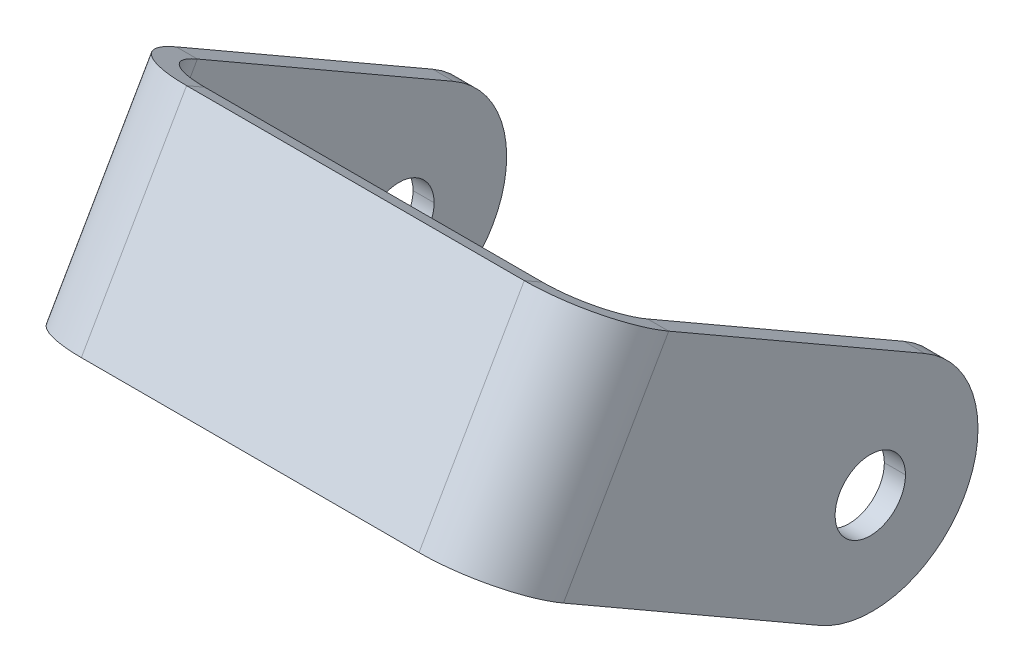
ISO-10303-21;
HEADER;
FILE_DESCRIPTION(('STEP AP214'),'2;1');
FILE_NAME('part.step','',(''),(''),'','','');
FILE_SCHEMA(('AUTOMOTIVE_DESIGN { 1 0 10303 214 1 1 1 1 }'));
ENDSEC;
DATA;
#1=APPLICATION_CONTEXT('core data for automotive mechanical design processes');
#2=APPLICATION_PROTOCOL_DEFINITION('international standard','automotive_design',2000,#1);
#3=PRODUCT_CONTEXT('',#1,'mechanical');
#4=PRODUCT('Part','Part','',(#3));
#5=PRODUCT_RELATED_PRODUCT_CATEGORY('part','',(#4));
#6=PRODUCT_DEFINITION_FORMATION('','',#4);
#7=PRODUCT_DEFINITION_CONTEXT('part definition',#1,'design');
#8=PRODUCT_DEFINITION('design','',#6,#7);
#9=PRODUCT_DEFINITION_SHAPE('','',#8);
#10=(LENGTH_UNIT() NAMED_UNIT(*) SI_UNIT(.MILLI.,.METRE.));
#11=(NAMED_UNIT(*) PLANE_ANGLE_UNIT() SI_UNIT($,.RADIAN.));
#12=(NAMED_UNIT(*) SI_UNIT($,.STERADIAN.) SOLID_ANGLE_UNIT());
#13=UNCERTAINTY_MEASURE_WITH_UNIT(LENGTH_MEASURE(1.E-05),#10,'distance_accuracy_value','');
#14=(GEOMETRIC_REPRESENTATION_CONTEXT(3) GLOBAL_UNCERTAINTY_ASSIGNED_CONTEXT((#13)) GLOBAL_UNIT_ASSIGNED_CONTEXT((#10,
#11,#12)) REPRESENTATION_CONTEXT('',''));
#15=CARTESIAN_POINT('',(0.,0.,0.));
#16=DIRECTION('',(0.,0.,1.));
#17=DIRECTION('',(1.,0.,0.));
#18=AXIS2_PLACEMENT_3D('',#15,#16,#17);
#19=CARTESIAN_POINT('',(-17.5,0.271763503020184,-40.4688212148155));
#20=DIRECTION('',(1.,0.,0.));
#21=DIRECTION('',(0.,0.,-1.));
#22=AXIS2_PLACEMENT_3D('',#19,#20,#21);
#23=CYLINDRICAL_SURFACE('',#22,7.5);
#24=CARTESIAN_POINT('',(16.,0.271763503020242,-40.4688212148154));
#25=DIRECTION('',(1.,0.,0.));
#26=DIRECTION('',(0.,0.,1.));
#27=AXIS2_PLACEMENT_3D('',#24,#25,#26);
#28=CIRCLE('',#27,7.5);
#29=CARTESIAN_POINT('',(16.,-6.22871244684351,-36.7279907688793));
#30=VERTEX_POINT('',#29);
#31=CARTESIAN_POINT('',(16.,0.271763503020244,-47.9688212148154));
#32=VERTEX_POINT('',#31);
#33=EDGE_CURVE('E11',#30,#32,#28,.T.);
#34=ORIENTED_EDGE('',*,*,#33,.T.);
#35=DIRECTION('',(1.,0.,0.));
#36=VECTOR('',#35,1.);
#37=CARTESIAN_POINT('',(-17.5,0.271763503020184,-47.9688212148155));
#38=LINE('',#37,#36);
#39=CARTESIAN_POINT('',(17.5,0.271763503020244,-47.9688212148154));
#40=VERTEX_POINT('',#39);
#41=EDGE_CURVE('E27',#32,#40,#38,.T.);
#42=ORIENTED_EDGE('',*,*,#41,.T.);
#43=CARTESIAN_POINT('',(17.5,0.271763503020245,-40.4688212148154));
#44=DIRECTION('',(-1.,0.,0.));
#45=DIRECTION('',(0.,0.,-1.));
#46=AXIS2_PLACEMENT_3D('',#43,#44,#45);
#47=CIRCLE('',#46,7.5);
#48=CARTESIAN_POINT('',(17.5,-6.2287124468435,-36.7279907688793));
#49=VERTEX_POINT('',#48);
#50=EDGE_CURVE('E178',#40,#49,#47,.T.);
#51=ORIENTED_EDGE('',*,*,#50,.T.);
#52=DIRECTION('',(1.,0.,0.));
#53=VECTOR('',#52,1.);
#54=CARTESIAN_POINT('',(-17.5,-6.22871244684357,-36.7279907688794));
#55=LINE('',#54,#53);
#56=EDGE_CURVE('E245',#30,#49,#55,.T.);
#57=ORIENTED_EDGE('',*,*,#56,.F.);
#58=EDGE_LOOP('',(#34,#42,#51,#57));
#59=FACE_BOUND('',#58,.T.);
#60=ADVANCED_FACE('F16',(#59),#23,.T.);
#61=CARTESIAN_POINT('',(-17.5,0.,-40.3124294068875));
#62=DIRECTION('',(1.,0.,0.));
#63=DIRECTION('',(0.,0.,-1.));
#64=AXIS2_PLACEMENT_3D('',#61,#62,#63);
#65=CYLINDRICAL_SURFACE('',#64,2.5);
#66=CARTESIAN_POINT('',(16.,0.,-40.3124294068874));
#67=DIRECTION('',(-1.,0.,0.));
#68=DIRECTION('',(0.,0.,1.));
#69=AXIS2_PLACEMENT_3D('',#66,#67,#68);
#70=CIRCLE('',#69,2.5);
#71=CARTESIAN_POINT('',(16.,0.,-42.8124294068873));
#72=VERTEX_POINT('',#71);
#73=CARTESIAN_POINT('',(16.,0.,-37.8124294068874));
#74=VERTEX_POINT('',#73);
#75=EDGE_CURVE('E164',#72,#74,#70,.T.);
#76=ORIENTED_EDGE('',*,*,#75,.T.);
#77=DIRECTION('',(1.,0.,0.));
#78=VECTOR('',#77,1.);
#79=CARTESIAN_POINT('',(-17.5,0.,-37.8124294068874));
#80=LINE('',#79,#78);
#81=CARTESIAN_POINT('',(17.5,0.,-37.8124294068874));
#82=VERTEX_POINT('',#81);
#83=EDGE_CURVE('E179',#74,#82,#80,.T.);
#84=ORIENTED_EDGE('',*,*,#83,.T.);
#85=CARTESIAN_POINT('',(17.5,0.,-40.3124294068874));
#86=DIRECTION('',(-1.,0.,0.));
#87=DIRECTION('',(0.,0.,1.));
#88=AXIS2_PLACEMENT_3D('',#85,#86,#87);
#89=CIRCLE('',#88,2.5);
#90=CARTESIAN_POINT('',(17.5,0.,-42.8124294068873));
#91=VERTEX_POINT('',#90);
#92=EDGE_CURVE('E166',#91,#82,#89,.T.);
#93=ORIENTED_EDGE('',*,*,#92,.F.);
#94=DIRECTION('',(1.,0.,0.));
#95=VECTOR('',#94,1.);
#96=CARTESIAN_POINT('',(-17.5,0.,-42.8124294068874));
#97=LINE('',#96,#95);
#98=EDGE_CURVE('E160',#72,#91,#97,.T.);
#99=ORIENTED_EDGE('',*,*,#98,.F.);
#100=EDGE_LOOP('',(#76,#84,#93,#99));
#101=FACE_BOUND('',#100,.T.);
#102=ADVANCED_FACE('F162',(#101),#65,.F.);
#103=CARTESIAN_POINT('',(-17.5,0.271763503020184,-40.4688212148155));
#104=DIRECTION('',(1.,0.,0.));
#105=DIRECTION('',(0.,0.,-1.));
#106=AXIS2_PLACEMENT_3D('',#103,#104,#105);
#107=CYLINDRICAL_SURFACE('',#106,7.5);
#108=CARTESIAN_POINT('',(-17.5,0.271763503020184,-40.4688212148155));
#109=DIRECTION('',(-1.,0.,0.));
#110=DIRECTION('',(0.,0.,-1.));
#111=AXIS2_PLACEMENT_3D('',#108,#109,#110);
#112=CIRCLE('',#111,7.5);
#113=CARTESIAN_POINT('',(-17.5,0.271763503020186,-47.9688212148155));
#114=VERTEX_POINT('',#113);
#115=CARTESIAN_POINT('',(-17.5,-6.22871244684357,-36.7279907688794));
#116=VERTEX_POINT('',#115);
#117=EDGE_CURVE('E199',#114,#116,#112,.T.);
#118=ORIENTED_EDGE('',*,*,#117,.F.);
#119=DIRECTION('',(1.,0.,0.));
#120=VECTOR('',#119,1.);
#121=CARTESIAN_POINT('',(-17.5,0.271763503020184,-47.9688212148155));
#122=LINE('',#121,#120);
#123=CARTESIAN_POINT('',(-16.,0.271763503020186,-47.9688212148155));
#124=VERTEX_POINT('',#123);
#125=EDGE_CURVE('E335',#114,#124,#122,.T.);
#126=ORIENTED_EDGE('',*,*,#125,.T.);
#127=CARTESIAN_POINT('',(-16.,0.271763503020187,-40.4688212148155));
#128=DIRECTION('',(-1.,0.,0.));
#129=DIRECTION('',(0.,0.,-1.));
#130=AXIS2_PLACEMENT_3D('',#127,#128,#129);
#131=CIRCLE('',#130,7.5);
#132=CARTESIAN_POINT('',(-16.,-6.22871244684357,-36.7279907688794));
#133=VERTEX_POINT('',#132);
#134=EDGE_CURVE('E221',#124,#133,#131,.T.);
#135=ORIENTED_EDGE('',*,*,#134,.T.);
#136=DIRECTION('',(1.,0.,0.));
#137=VECTOR('',#136,1.);
#138=CARTESIAN_POINT('',(-17.5,-6.22871244684357,-36.7279907688794));
#139=LINE('',#138,#137);
#140=EDGE_CURVE('E246',#116,#133,#139,.T.);
#141=ORIENTED_EDGE('',*,*,#140,.F.);
#142=EDGE_LOOP('',(#118,#126,#135,#141));
#143=FACE_BOUND('',#142,.T.);
#144=ADVANCED_FACE('F755',(#143),#107,.T.);
#145=CARTESIAN_POINT('',(-17.5,0.,-40.3124294068875));
#146=DIRECTION('',(1.,0.,0.));
#147=DIRECTION('',(0.,0.,-1.));
#148=AXIS2_PLACEMENT_3D('',#145,#146,#147);
#149=CYLINDRICAL_SURFACE('',#148,2.5);
#150=CARTESIAN_POINT('',(-17.5,0.,-40.3124294068875));
#151=DIRECTION('',(1.,0.,0.));
#152=DIRECTION('',(0.,0.,-1.));
#153=AXIS2_PLACEMENT_3D('',#150,#151,#152);
#154=CIRCLE('',#153,2.5);
#155=CARTESIAN_POINT('',(-17.5,0.,-37.8124294068874));
#156=VERTEX_POINT('',#155);
#157=CARTESIAN_POINT('',(-17.5,0.,-42.8124294068874));
#158=VERTEX_POINT('',#157);
#159=EDGE_CURVE('E254',#156,#158,#154,.T.);
#160=ORIENTED_EDGE('',*,*,#159,.F.);
#161=DIRECTION('',(1.,0.,0.));
#162=VECTOR('',#161,1.);
#163=CARTESIAN_POINT('',(-17.5,0.,-37.8124294068874));
#164=LINE('',#163,#162);
#165=CARTESIAN_POINT('',(-16.,0.,-37.8124294068874));
#166=VERTEX_POINT('',#165);
#167=EDGE_CURVE('E217',#156,#166,#164,.T.);
#168=ORIENTED_EDGE('',*,*,#167,.T.);
#169=CARTESIAN_POINT('',(-16.,0.,-40.3124294068875));
#170=DIRECTION('',(1.,0.,0.));
#171=DIRECTION('',(0.,0.,-1.));
#172=AXIS2_PLACEMENT_3D('',#169,#170,#171);
#173=CIRCLE('',#172,2.5);
#174=CARTESIAN_POINT('',(-16.,0.,-42.8124294068874));
#175=VERTEX_POINT('',#174);
#176=EDGE_CURVE('E222',#166,#175,#173,.T.);
#177=ORIENTED_EDGE('',*,*,#176,.T.);
#178=DIRECTION('',(1.,0.,0.));
#179=VECTOR('',#178,1.);
#180=CARTESIAN_POINT('',(-17.5,0.,-42.8124294068874));
#181=LINE('',#180,#179);
#182=EDGE_CURVE('E258',#158,#175,#181,.T.);
#183=ORIENTED_EDGE('',*,*,#182,.F.);
#184=EDGE_LOOP('',(#160,#168,#177,#183));
#185=FACE_BOUND('',#184,.T.);
#186=ADVANCED_FACE('F764',(#185),#149,.F.);
#187=CARTESIAN_POINT('',(17.5,-13.1983253106159,-48.8391520352316));
#188=DIRECTION('',(0.,0.866730126648501,-0.498777392791488));
#189=DIRECTION('',(-1.,0.,0.));
#190=AXIS2_PLACEMENT_3D('',#187,#188,#189);
#191=PLANE('',#190);
#192=ORIENTED_EDGE('',*,*,#56,.T.);
#193=DIRECTION('',(0.,-0.498777392791488,-0.866730126648501));
#194=VECTOR('',#193,1.);
#195=CARTESIAN_POINT('',(17.5,-13.1983253106159,-48.8391520352316));
#196=LINE('',#195,#194);
#197=CARTESIAN_POINT('',(17.5,4.25888343708619,-18.5035976025341));
#198=VERTEX_POINT('',#197);
#199=EDGE_CURVE('E211',#198,#49,#196,.T.);
#200=ORIENTED_EDGE('',*,*,#199,.F.);
#201=DIRECTION('',(1.,0.,0.));
#202=VECTOR('',#201,1.);
#203=CARTESIAN_POINT('',(16.,4.25888343708618,-18.5035976025341));
#204=LINE('',#203,#202);
#205=CARTESIAN_POINT('',(16.,4.25888343708618,-18.5035976025341));
#206=VERTEX_POINT('',#205);
#207=EDGE_CURVE('E303',#206,#198,#204,.T.);
#208=ORIENTED_EDGE('',*,*,#207,.F.);
#209=DIRECTION('',(0.,-0.498777392791488,-0.866730126648501));
#210=VECTOR('',#209,1.);
#211=CARTESIAN_POINT('',(16.,-13.1983253106159,-48.8391520352316));
#212=LINE('',#211,#210);
#213=EDGE_CURVE('E241',#206,#30,#212,.T.);
#214=ORIENTED_EDGE('',*,*,#213,.T.);
#215=EDGE_LOOP('',(#192,#200,#208,#214));
#216=FACE_BOUND('',#215,.T.);
#217=ADVANCED_FACE('F769',(#216),#191,.F.);
#218=CARTESIAN_POINT('',(-17.5,6.25399300825213,-15.0366770959401));
#219=DIRECTION('',(0.,0.866730126648501,-0.498777392791488));
#220=DIRECTION('',(-1.,0.,0.));
#221=AXIS2_PLACEMENT_3D('',#218,#219,#220);
#222=PLANE('',#221);
#223=ORIENTED_EDGE('',*,*,#140,.T.);
#224=DIRECTION('',(0.,0.498777392791488,0.866730126648501));
#225=VECTOR('',#224,1.);
#226=CARTESIAN_POINT('',(-16.,6.25399300825213,-15.0366770959401));
#227=LINE('',#226,#225);
#228=CARTESIAN_POINT('',(-16.,4.25888343708618,-18.5035976025341));
#229=VERTEX_POINT('',#228);
#230=EDGE_CURVE('E343',#133,#229,#227,.T.);
#231=ORIENTED_EDGE('',*,*,#230,.T.);
#232=DIRECTION('',(-1.,0.,0.));
#233=VECTOR('',#232,1.);
#234=CARTESIAN_POINT('',(-16.,4.25888343708619,-18.5035976025341));
#235=LINE('',#234,#233);
#236=CARTESIAN_POINT('',(-17.5,4.25888343708618,-18.5035976025341));
#237=VERTEX_POINT('',#236);
#238=EDGE_CURVE('E339',#229,#237,#235,.T.);
#239=ORIENTED_EDGE('',*,*,#238,.T.);
#240=DIRECTION('',(0.,0.498777392791488,0.866730126648501));
#241=VECTOR('',#240,1.);
#242=CARTESIAN_POINT('',(-17.5,6.25399300825213,-15.0366770959401));
#243=LINE('',#242,#241);
#244=EDGE_CURVE('E196',#116,#237,#243,.T.);
#245=ORIENTED_EDGE('',*,*,#244,.F.);
#246=EDGE_LOOP('',(#223,#231,#239,#245));
#247=FACE_BOUND('',#246,.T.);
#248=ADVANCED_FACE('F443',(#247),#222,.F.);
#249=CARTESIAN_POINT('',(-16.,19.2549449079797,-22.5183379878124));
#250=DIRECTION('',(0.,0.498777392791488,0.866730126648501));
#251=DIRECTION('',(1.,0.,0.));
#252=AXIS2_PLACEMENT_3D('',#249,#250,#251);
#253=PLANE('',#252);
#254=DIRECTION('',(0.,-0.866730126648501,0.498777392791488));
#255=VECTOR('',#254,1.);
#256=CARTESIAN_POINT('',(-12.,19.2549449079797,-22.5183379878124));
#257=LINE('',#256,#255);
#258=CARTESIAN_POINT('',(-12.,19.2549449079797,-22.5183379878124));
#259=VERTEX_POINT('',#258);
#260=CARTESIAN_POINT('',(-12.,6.25399300825213,-15.0366770959401));
#261=VERTEX_POINT('',#260);
#262=EDGE_CURVE('E232',#259,#261,#257,.T.);
#263=ORIENTED_EDGE('',*,*,#262,.F.);
#264=DIRECTION('',(1.,0.,0.));
#265=VECTOR('',#264,1.);
#266=CARTESIAN_POINT('',(-16.,19.2549449079797,-22.5183379878124));
#267=LINE('',#266,#265);
#268=CARTESIAN_POINT('',(12.,19.2549449079797,-22.5183379878124));
#269=VERTEX_POINT('',#268);
#270=EDGE_CURVE('E344',#259,#269,#267,.T.);
#271=ORIENTED_EDGE('',*,*,#270,.T.);
#272=DIRECTION('',(0.,0.866730126648501,-0.498777392791488));
#273=VECTOR('',#272,1.);
#274=CARTESIAN_POINT('',(12.,6.25399300825213,-15.0366770959401));
#275=LINE('',#274,#273);
#276=CARTESIAN_POINT('',(12.,6.25399300825213,-15.0366770959401));
#277=VERTEX_POINT('',#276);
#278=EDGE_CURVE('E204',#277,#269,#275,.T.);
#279=ORIENTED_EDGE('',*,*,#278,.F.);
#280=DIRECTION('',(1.,0.,0.));
#281=VECTOR('',#280,1.);
#282=CARTESIAN_POINT('',(-16.,6.25399300825214,-15.0366770959401));
#283=LINE('',#282,#281);
#284=EDGE_CURVE('E208',#261,#277,#283,.T.);
#285=ORIENTED_EDGE('',*,*,#284,.F.);
#286=EDGE_LOOP('',(#263,#271,#279,#285));
#287=FACE_BOUND('',#286,.T.);
#288=ADVANCED_FACE('F427',(#287),#253,.F.);
#289=CARTESIAN_POINT('',(-16.,20.0031109971669,-21.2182427978397));
#290=DIRECTION('',(0.,0.498777392791488,0.866730126648501));
#291=DIRECTION('',(1.,0.,0.));
#292=AXIS2_PLACEMENT_3D('',#289,#290,#291);
#293=PLANE('',#292);
#294=DIRECTION('',(1.,0.,0.));
#295=VECTOR('',#294,1.);
#296=CARTESIAN_POINT('',(-16.,20.0031109971669,-21.2182427978397));
#297=LINE('',#296,#295);
#298=CARTESIAN_POINT('',(-12.,20.0031109971668,-21.2182427978397));
#299=VERTEX_POINT('',#298);
#300=CARTESIAN_POINT('',(12.,20.0031109971669,-21.2182427978397));
#301=VERTEX_POINT('',#300);
#302=EDGE_CURVE('E20',#299,#301,#297,.T.);
#303=ORIENTED_EDGE('',*,*,#302,.F.);
#304=DIRECTION('',(0.,-0.866730126648501,0.498777392791488));
#305=VECTOR('',#304,1.);
#306=CARTESIAN_POINT('',(-12.,20.0031109971668,-21.2182427978397));
#307=LINE('',#306,#305);
#308=CARTESIAN_POINT('',(-12.,7.00215909743936,-13.7365819059673));
#309=VERTEX_POINT('',#308);
#310=EDGE_CURVE('E352',#299,#309,#307,.T.);
#311=ORIENTED_EDGE('',*,*,#310,.T.);
#312=DIRECTION('',(1.,0.,0.));
#313=VECTOR('',#312,1.);
#314=CARTESIAN_POINT('',(-16.,7.00215909743937,-13.7365819059673));
#315=LINE('',#314,#313);
#316=CARTESIAN_POINT('',(12.,7.00215909743936,-13.7365819059673));
#317=VERTEX_POINT('',#316);
#318=EDGE_CURVE('E288',#309,#317,#315,.T.);
#319=ORIENTED_EDGE('',*,*,#318,.T.);
#320=DIRECTION('',(0.,0.866730126648501,-0.498777392791488));
#321=VECTOR('',#320,1.);
#322=CARTESIAN_POINT('',(12.,7.00215909743936,-13.7365819059673));
#323=LINE('',#322,#321);
#324=EDGE_CURVE('E227',#317,#301,#323,.T.);
#325=ORIENTED_EDGE('',*,*,#324,.T.);
#326=EDGE_LOOP('',(#303,#311,#319,#325));
#327=FACE_BOUND('',#326,.T.);
#328=ADVANCED_FACE('F286',(#327),#293,.T.);
#329=CARTESIAN_POINT('',(-16.,19.2549449079797,-22.5183379878124));
#330=DIRECTION('',(0.,-0.866730126648501,0.498777392791488));
#331=DIRECTION('',(-1.,0.,0.));
#332=AXIS2_PLACEMENT_3D('',#329,#330,#331);
#333=PLANE('',#332);
#334=ORIENTED_EDGE('',*,*,#270,.F.);
#335=DIRECTION('',(0.,0.498777392791488,0.866730126648501));
#336=VECTOR('',#335,1.);
#337=CARTESIAN_POINT('',(-12.,19.2549449079797,-22.5183379878124));
#338=LINE('',#337,#336);
#339=EDGE_CURVE('E223',#259,#299,#338,.T.);
#340=ORIENTED_EDGE('',*,*,#339,.T.);
#341=ORIENTED_EDGE('',*,*,#302,.T.);
#342=DIRECTION('',(0.,0.498777392791488,0.866730126648501));
#343=VECTOR('',#342,1.);
#344=CARTESIAN_POINT('',(12.,19.2549449079797,-22.5183379878124));
#345=LINE('',#344,#343);
#346=EDGE_CURVE('E209',#269,#301,#345,.T.);
#347=ORIENTED_EDGE('',*,*,#346,.F.);
#348=EDGE_LOOP('',(#334,#340,#341,#347));
#349=FACE_BOUND('',#348,.T.);
#350=ADVANCED_FACE('F277',(#349),#333,.F.);
#351=CARTESIAN_POINT('',(-16.,6.25399300825214,-15.0366770959401));
#352=DIRECTION('',(0.,-0.866730126648501,0.498777392791488));
#353=DIRECTION('',(-1.,0.,0.));
#354=AXIS2_PLACEMENT_3D('',#351,#352,#353);
#355=PLANE('',#354);
#356=DIRECTION('',(0.,0.498777392791488,0.866730126648501));
#357=VECTOR('',#356,1.);
#358=CARTESIAN_POINT('',(-12.,6.25399300825213,-15.0366770959401));
#359=LINE('',#358,#357);
#360=EDGE_CURVE('E253',#261,#309,#359,.T.);
#361=ORIENTED_EDGE('',*,*,#360,.F.);
#362=ORIENTED_EDGE('',*,*,#284,.T.);
#363=DIRECTION('',(0.,0.498777392791488,0.866730126648501));
#364=VECTOR('',#363,1.);
#365=CARTESIAN_POINT('',(12.,6.25399300825213,-15.0366770959401));
#366=LINE('',#365,#364);
#367=EDGE_CURVE('E206',#277,#317,#366,.T.);
#368=ORIENTED_EDGE('',*,*,#367,.T.);
#369=ORIENTED_EDGE('',*,*,#318,.F.);
#370=EDGE_LOOP('',(#361,#362,#368,#369));
#371=FACE_BOUND('',#370,.T.);
#372=ADVANCED_FACE('F431',(#371),#355,.T.);
#373=CARTESIAN_POINT('',(12.,17.2598353368137,-25.9852584944064));
#374=DIRECTION('',(0.,0.866730126648501,-0.498777392791488));
#375=DIRECTION('',(-1.,0.,0.));
#376=AXIS2_PLACEMENT_3D('',#373,#374,#375);
#377=PLANE('',#376);
#378=DIRECTION('',(1.,0.,0.));
#379=VECTOR('',#378,1.);
#380=CARTESIAN_POINT('',(16.,17.2598353368137,-25.9852584944064));
#381=LINE('',#380,#379);
#382=CARTESIAN_POINT('',(16.,17.2598353368137,-25.9852584944064));
#383=VERTEX_POINT('',#382);
#384=CARTESIAN_POINT('',(17.5,17.2598353368137,-25.9852584944064));
#385=VERTEX_POINT('',#384);
#386=EDGE_CURVE('E215',#383,#385,#381,.T.);
#387=ORIENTED_EDGE('',*,*,#386,.F.);
#388=CARTESIAN_POINT('',(12.,17.2598353368137,-25.9852584944064));
#389=DIRECTION('',(0.,0.866730126648501,-0.498777392791488));
#390=DIRECTION('',(0.,-0.498777392791488,-0.866730126648501));
#391=AXIS2_PLACEMENT_3D('',#388,#389,#390);
#392=CIRCLE('',#391,4.);
#393=EDGE_CURVE('E200',#269,#383,#392,.T.);
#394=ORIENTED_EDGE('',*,*,#393,.F.);
#395=ORIENTED_EDGE('',*,*,#346,.T.);
#396=CARTESIAN_POINT('',(12.,17.2598353368137,-25.9852584944064));
#397=DIRECTION('',(0.,0.866730126648501,-0.498777392791487));
#398=DIRECTION('',(0.,-0.498777392791487,-0.866730126648501));
#399=AXIS2_PLACEMENT_3D('',#396,#397,#398);
#400=CIRCLE('',#399,5.5);
#401=EDGE_CURVE('E296',#301,#385,#400,.T.);
#402=ORIENTED_EDGE('',*,*,#401,.T.);
#403=EDGE_LOOP('',(#387,#394,#395,#402));
#404=FACE_BOUND('',#403,.T.);
#405=ADVANCED_FACE('F417',(#404),#377,.T.);
#406=CARTESIAN_POINT('',(12.,4.25888343708618,-18.5035976025341));
#407=DIRECTION('',(0.,0.866730126648501,-0.498777392791488));
#408=DIRECTION('',(-1.,0.,0.));
#409=AXIS2_PLACEMENT_3D('',#406,#407,#408);
#410=PLANE('',#409);
#411=CARTESIAN_POINT('',(12.,4.25888343708618,-18.5035976025341));
#412=DIRECTION('',(0.,-0.866730126648501,0.498777392791488));
#413=DIRECTION('',(0.,-0.498777392791488,-0.866730126648501));
#414=AXIS2_PLACEMENT_3D('',#411,#412,#413);
#415=CIRCLE('',#414,4.);
#416=EDGE_CURVE('E390',#206,#277,#415,.T.);
#417=ORIENTED_EDGE('',*,*,#416,.F.);
#418=ORIENTED_EDGE('',*,*,#207,.T.);
#419=CARTESIAN_POINT('',(12.,4.25888343708618,-18.5035976025341));
#420=DIRECTION('',(0.,-0.866730126648501,0.498777392791488));
#421=DIRECTION('',(0.,-0.498777392791488,-0.866730126648501));
#422=AXIS2_PLACEMENT_3D('',#419,#420,#421);
#423=CIRCLE('',#422,5.5);
#424=EDGE_CURVE('E311',#198,#317,#423,.T.);
#425=ORIENTED_EDGE('',*,*,#424,.T.);
#426=ORIENTED_EDGE('',*,*,#367,.F.);
#427=EDGE_LOOP('',(#417,#418,#425,#426));
#428=FACE_BOUND('',#427,.T.);
#429=ADVANCED_FACE('F429',(#428),#410,.F.);
#430=CARTESIAN_POINT('',(12.,4.25888343708618,-18.5035976025341));
#431=DIRECTION('',(0.,-0.866730126648501,0.498777392791488));
#432=DIRECTION('',(1.,0.,0.));
#433=AXIS2_PLACEMENT_3D('',#430,#431,#432);
#434=CYLINDRICAL_SURFACE('',#433,5.5);
#435=ORIENTED_EDGE('',*,*,#324,.F.);
#436=ORIENTED_EDGE('',*,*,#424,.F.);
#437=DIRECTION('',(0.,0.866730126648501,-0.498777392791488));
#438=VECTOR('',#437,1.);
#439=CARTESIAN_POINT('',(17.5,-6.93968474648738,-12.0591548978607));
#440=LINE('',#439,#438);
#441=EDGE_CURVE('E249',#198,#385,#440,.T.);
#442=ORIENTED_EDGE('',*,*,#441,.T.);
#443=ORIENTED_EDGE('',*,*,#401,.F.);
#444=EDGE_LOOP('',(#435,#436,#442,#443));
#445=FACE_BOUND('',#444,.T.);
#446=ADVANCED_FACE('F297',(#445),#434,.T.);
#447=CARTESIAN_POINT('',(12.,4.25888343708618,-18.5035976025341));
#448=DIRECTION('',(0.,-0.866730126648501,0.498777392791488));
#449=DIRECTION('',(1.,0.,0.));
#450=AXIS2_PLACEMENT_3D('',#447,#448,#449);
#451=CYLINDRICAL_SURFACE('',#450,4.);
#452=ORIENTED_EDGE('',*,*,#278,.T.);
#453=ORIENTED_EDGE('',*,*,#393,.T.);
#454=DIRECTION('',(0.,-0.866730126648501,0.498777392791488));
#455=VECTOR('',#454,1.);
#456=CARTESIAN_POINT('',(16.,17.2598353368137,-25.9852584944064));
#457=LINE('',#456,#455);
#458=EDGE_CURVE('E205',#383,#206,#457,.T.);
#459=ORIENTED_EDGE('',*,*,#458,.T.);
#460=ORIENTED_EDGE('',*,*,#416,.T.);
#461=EDGE_LOOP('',(#452,#453,#459,#460));
#462=FACE_BOUND('',#461,.T.);
#463=ADVANCED_FACE('F423',(#462),#451,.F.);
#464=CARTESIAN_POINT('',(17.5,19.2549449079797,-22.5183379878124));
#465=DIRECTION('',(0.,-0.866730126648501,0.498777392791488));
#466=DIRECTION('',(-1.,0.,0.));
#467=AXIS2_PLACEMENT_3D('',#464,#465,#466);
#468=PLANE('',#467);
#469=DIRECTION('',(0.,0.498777392791488,0.866730126648501));
#470=VECTOR('',#469,1.);
#471=CARTESIAN_POINT('',(17.5,19.2549449079797,-22.5183379878124));
#472=LINE('',#471,#470);
#473=CARTESIAN_POINT('',(17.5,6.772239452884,-44.2096516607516));
#474=VERTEX_POINT('',#473);
#475=EDGE_CURVE('E216',#474,#385,#472,.T.);
#476=ORIENTED_EDGE('',*,*,#475,.F.);
#477=DIRECTION('',(1.,0.,0.));
#478=VECTOR('',#477,1.);
#479=CARTESIAN_POINT('',(-17.5,6.77223945288394,-44.2096516607517));
#480=LINE('',#479,#478);
#481=CARTESIAN_POINT('',(16.,6.77223945288399,-44.2096516607516));
#482=VERTEX_POINT('',#481);
#483=EDGE_CURVE('E236',#482,#474,#480,.T.);
#484=ORIENTED_EDGE('',*,*,#483,.F.);
#485=DIRECTION('',(0.,0.498777392791488,0.866730126648501));
#486=VECTOR('',#485,1.);
#487=CARTESIAN_POINT('',(16.,19.2549449079797,-22.5183379878124));
#488=LINE('',#487,#486);
#489=EDGE_CURVE('E403',#482,#383,#488,.T.);
#490=ORIENTED_EDGE('',*,*,#489,.T.);
#491=ORIENTED_EDGE('',*,*,#386,.T.);
#492=EDGE_LOOP('',(#476,#484,#490,#491));
#493=FACE_BOUND('',#492,.T.);
#494=ADVANCED_FACE('F412',(#493),#468,.F.);
#495=CARTESIAN_POINT('',(17.5,0.,0.));
#496=DIRECTION('',(-1.,0.,0.));
#497=DIRECTION('',(0.,0.,1.));
#498=AXIS2_PLACEMENT_3D('',#495,#496,#497);
#499=PLANE('',#498);
#500=ORIENTED_EDGE('',*,*,#199,.T.);
#501=ORIENTED_EDGE('',*,*,#50,.F.);
#502=CARTESIAN_POINT('',(17.5,0.271763503020245,-40.4688212148154));
#503=DIRECTION('',(-1.,0.,0.));
#504=DIRECTION('',(0.,0.,-1.));
#505=AXIS2_PLACEMENT_3D('',#502,#503,#504);
#506=CIRCLE('',#505,7.5);
#507=EDGE_CURVE('E259',#474,#40,#506,.T.);
#508=ORIENTED_EDGE('',*,*,#507,.F.);
#509=ORIENTED_EDGE('',*,*,#475,.T.);
#510=ORIENTED_EDGE('',*,*,#441,.F.);
#511=EDGE_LOOP('',(#500,#501,#508,#509,#510));
#512=FACE_BOUND('',#511,.T.);
#513=ORIENTED_EDGE('',*,*,#92,.T.);
#514=CARTESIAN_POINT('',(17.5,0.,-40.3124294068874));
#515=DIRECTION('',(-1.,0.,0.));
#516=DIRECTION('',(0.,0.,1.));
#517=AXIS2_PLACEMENT_3D('',#514,#515,#516);
#518=CIRCLE('',#517,2.5);
#519=EDGE_CURVE('E250',#82,#91,#518,.T.);
#520=ORIENTED_EDGE('',*,*,#519,.T.);
#521=EDGE_LOOP('',(#513,#520));
#522=FACE_BOUND('',#521,.T.);
#523=ADVANCED_FACE('F866',(#512,#522),#499,.F.);
#524=CARTESIAN_POINT('',(16.,0.,0.));
#525=DIRECTION('',(-1.,0.,0.));
#526=DIRECTION('',(0.,0.,1.));
#527=AXIS2_PLACEMENT_3D('',#524,#525,#526);
#528=PLANE('',#527);
#529=ORIENTED_EDGE('',*,*,#33,.F.);
#530=ORIENTED_EDGE('',*,*,#213,.F.);
#531=ORIENTED_EDGE('',*,*,#458,.F.);
#532=ORIENTED_EDGE('',*,*,#489,.F.);
#533=CARTESIAN_POINT('',(16.,0.271763503020242,-40.4688212148154));
#534=DIRECTION('',(1.,0.,0.));
#535=DIRECTION('',(0.,0.,1.));
#536=AXIS2_PLACEMENT_3D('',#533,#534,#535);
#537=CIRCLE('',#536,7.5);
#538=EDGE_CURVE('E173',#32,#482,#537,.T.);
#539=ORIENTED_EDGE('',*,*,#538,.F.);
#540=EDGE_LOOP('',(#529,#530,#531,#532,#539));
#541=FACE_BOUND('',#540,.T.);
#542=ORIENTED_EDGE('',*,*,#75,.F.);
#543=CARTESIAN_POINT('',(16.,0.,-40.3124294068874));
#544=DIRECTION('',(-1.,0.,0.));
#545=DIRECTION('',(0.,0.,1.));
#546=AXIS2_PLACEMENT_3D('',#543,#544,#545);
#547=CIRCLE('',#546,2.5);
#548=EDGE_CURVE('E172',#74,#72,#547,.T.);
#549=ORIENTED_EDGE('',*,*,#548,.F.);
#550=EDGE_LOOP('',(#542,#549));
#551=FACE_BOUND('',#550,.T.);
#552=ADVANCED_FACE('F176',(#541,#551),#528,.T.);
#553=CARTESIAN_POINT('',(-12.,4.25888343708618,-18.5035976025341));
#554=DIRECTION('',(0.,-0.866730126648501,0.498777392791488));
#555=DIRECTION('',(-1.,0.,0.));
#556=AXIS2_PLACEMENT_3D('',#553,#554,#555);
#557=PLANE('',#556);
#558=ORIENTED_EDGE('',*,*,#238,.F.);
#559=CARTESIAN_POINT('',(-12.,4.25888343708618,-18.5035976025341));
#560=DIRECTION('',(0.,-0.866730126648501,0.498777392791488));
#561=DIRECTION('',(0.,0.498777392791488,0.866730126648501));
#562=AXIS2_PLACEMENT_3D('',#559,#560,#561);
#563=CIRCLE('',#562,4.);
#564=EDGE_CURVE('E332',#261,#229,#563,.T.);
#565=ORIENTED_EDGE('',*,*,#564,.F.);
#566=ORIENTED_EDGE('',*,*,#360,.T.);
#567=CARTESIAN_POINT('',(-12.,4.25888343708618,-18.5035976025341));
#568=DIRECTION('',(0.,-0.866730126648501,0.498777392791488));
#569=DIRECTION('',(0.,0.498777392791488,0.866730126648501));
#570=AXIS2_PLACEMENT_3D('',#567,#568,#569);
#571=CIRCLE('',#570,5.5);
#572=EDGE_CURVE('E331',#309,#237,#571,.T.);
#573=ORIENTED_EDGE('',*,*,#572,.T.);
#574=EDGE_LOOP('',(#558,#565,#566,#573));
#575=FACE_BOUND('',#574,.T.);
#576=ADVANCED_FACE('F439',(#575),#557,.T.);
#577=CARTESIAN_POINT('',(-12.,17.2598353368137,-25.9852584944064));
#578=DIRECTION('',(0.,-0.866730126648501,0.498777392791488));
#579=DIRECTION('',(-1.,0.,0.));
#580=AXIS2_PLACEMENT_3D('',#577,#578,#579);
#581=PLANE('',#580);
#582=CARTESIAN_POINT('',(-12.,17.2598353368137,-25.9852584944064));
#583=DIRECTION('',(0.,0.866730126648501,-0.498777392791488));
#584=DIRECTION('',(0.,0.498777392791488,0.866730126648501));
#585=AXIS2_PLACEMENT_3D('',#582,#583,#584);
#586=CIRCLE('',#585,4.);
#587=CARTESIAN_POINT('',(-16.,17.2598353368137,-25.9852584944064));
#588=VERTEX_POINT('',#587);
#589=EDGE_CURVE('E316',#588,#259,#586,.T.);
#590=ORIENTED_EDGE('',*,*,#589,.F.);
#591=DIRECTION('',(-1.,0.,0.));
#592=VECTOR('',#591,1.);
#593=CARTESIAN_POINT('',(-16.,17.2598353368137,-25.9852584944064));
#594=LINE('',#593,#592);
#595=CARTESIAN_POINT('',(-17.5,17.2598353368137,-25.9852584944064));
#596=VERTEX_POINT('',#595);
#597=EDGE_CURVE('E327',#588,#596,#594,.T.);
#598=ORIENTED_EDGE('',*,*,#597,.T.);
#599=CARTESIAN_POINT('',(-12.,17.2598353368137,-25.9852584944064));
#600=DIRECTION('',(0.,0.866730126648501,-0.498777392791488));
#601=DIRECTION('',(0.,0.498777392791488,0.866730126648501));
#602=AXIS2_PLACEMENT_3D('',#599,#600,#601);
#603=CIRCLE('',#602,5.5);
#604=EDGE_CURVE('E231',#596,#299,#603,.T.);
#605=ORIENTED_EDGE('',*,*,#604,.T.);
#606=ORIENTED_EDGE('',*,*,#339,.F.);
#607=EDGE_LOOP('',(#590,#598,#605,#606));
#608=FACE_BOUND('',#607,.T.);
#609=ADVANCED_FACE('F820',(#608),#581,.F.);
#610=CARTESIAN_POINT('',(-12.,17.2598353368137,-25.9852584944064));
#611=DIRECTION('',(0.,0.866730126648501,-0.498777392791488));
#612=DIRECTION('',(-1.,0.,0.));
#613=AXIS2_PLACEMENT_3D('',#610,#611,#612);
#614=CYLINDRICAL_SURFACE('',#613,5.5);
#615=ORIENTED_EDGE('',*,*,#310,.F.);
#616=ORIENTED_EDGE('',*,*,#604,.F.);
#617=DIRECTION('',(0.,-0.866730126648501,0.498777392791488));
#618=VECTOR('',#617,1.);
#619=CARTESIAN_POINT('',(-17.5,-6.93968474648738,-12.0591548978607));
#620=LINE('',#619,#618);
#621=EDGE_CURVE('E228',#596,#237,#620,.T.);
#622=ORIENTED_EDGE('',*,*,#621,.T.);
#623=ORIENTED_EDGE('',*,*,#572,.F.);
#624=EDGE_LOOP('',(#615,#616,#622,#623));
#625=FACE_BOUND('',#624,.T.);
#626=ADVANCED_FACE('F437',(#625),#614,.T.);
#627=CARTESIAN_POINT('',(-12.,17.2598353368137,-25.9852584944064));
#628=DIRECTION('',(0.,0.866730126648501,-0.498777392791488));
#629=DIRECTION('',(-1.,0.,0.));
#630=AXIS2_PLACEMENT_3D('',#627,#628,#629);
#631=CYLINDRICAL_SURFACE('',#630,4.);
#632=ORIENTED_EDGE('',*,*,#262,.T.);
#633=ORIENTED_EDGE('',*,*,#564,.T.);
#634=DIRECTION('',(0.,0.866730126648501,-0.498777392791488));
#635=VECTOR('',#634,1.);
#636=CARTESIAN_POINT('',(-16.,4.25888343708619,-18.5035976025341));
#637=LINE('',#636,#635);
#638=EDGE_CURVE('E320',#229,#588,#637,.T.);
#639=ORIENTED_EDGE('',*,*,#638,.T.);
#640=ORIENTED_EDGE('',*,*,#589,.T.);
#641=EDGE_LOOP('',(#632,#633,#639,#640));
#642=FACE_BOUND('',#641,.T.);
#643=ADVANCED_FACE('F361',(#642),#631,.F.);
#644=CARTESIAN_POINT('',(-17.5,-0.197373410888401,-56.3208129271039));
#645=DIRECTION('',(0.,-0.866730126648501,0.498777392791488));
#646=DIRECTION('',(-1.,0.,0.));
#647=AXIS2_PLACEMENT_3D('',#644,#645,#646);
#648=PLANE('',#647);
#649=DIRECTION('',(0.,-0.498777392791488,-0.866730126648501));
#650=VECTOR('',#649,1.);
#651=CARTESIAN_POINT('',(-16.,-0.197373410888403,-56.3208129271039));
#652=LINE('',#651,#650);
#653=CARTESIAN_POINT('',(-16.,6.77223945288393,-44.2096516607517));
#654=VERTEX_POINT('',#653);
#655=EDGE_CURVE('E321',#588,#654,#652,.T.);
#656=ORIENTED_EDGE('',*,*,#655,.T.);
#657=DIRECTION('',(1.,0.,0.));
#658=VECTOR('',#657,1.);
#659=CARTESIAN_POINT('',(-17.5,6.77223945288394,-44.2096516607517));
#660=LINE('',#659,#658);
#661=CARTESIAN_POINT('',(-17.5,6.77223945288394,-44.2096516607517));
#662=VERTEX_POINT('',#661);
#663=EDGE_CURVE('E190',#662,#654,#660,.T.);
#664=ORIENTED_EDGE('',*,*,#663,.F.);
#665=DIRECTION('',(0.,-0.498777392791488,-0.866730126648501));
#666=VECTOR('',#665,1.);
#667=CARTESIAN_POINT('',(-17.5,-0.197373410888401,-56.3208129271039));
#668=LINE('',#667,#666);
#669=EDGE_CURVE('E322',#596,#662,#668,.T.);
#670=ORIENTED_EDGE('',*,*,#669,.F.);
#671=ORIENTED_EDGE('',*,*,#597,.F.);
#672=EDGE_LOOP('',(#656,#664,#670,#671));
#673=FACE_BOUND('',#672,.T.);
#674=ADVANCED_FACE('F370',(#673),#648,.F.);
#675=CARTESIAN_POINT('',(-17.5,0.,0.));
#676=DIRECTION('',(1.,0.,0.));
#677=DIRECTION('',(0.,1.,0.));
#678=AXIS2_PLACEMENT_3D('',#675,#676,#677);
#679=PLANE('',#678);
#680=ORIENTED_EDGE('',*,*,#669,.T.);
#681=CARTESIAN_POINT('',(-17.5,0.271763503020184,-40.4688212148155));
#682=DIRECTION('',(-1.,0.,0.));
#683=DIRECTION('',(0.,0.,-1.));
#684=AXIS2_PLACEMENT_3D('',#681,#682,#683);
#685=CIRCLE('',#684,7.5);
#686=EDGE_CURVE('E326',#662,#114,#685,.T.);
#687=ORIENTED_EDGE('',*,*,#686,.T.);
#688=ORIENTED_EDGE('',*,*,#117,.T.);
#689=ORIENTED_EDGE('',*,*,#244,.T.);
#690=ORIENTED_EDGE('',*,*,#621,.F.);
#691=EDGE_LOOP('',(#680,#687,#688,#689,#690));
#692=FACE_BOUND('',#691,.T.);
#693=CARTESIAN_POINT('',(-17.5,0.,-40.3124294068875));
#694=DIRECTION('',(1.,0.,0.));
#695=DIRECTION('',(0.,0.,-1.));
#696=AXIS2_PLACEMENT_3D('',#693,#694,#695);
#697=CIRCLE('',#696,2.5);
#698=EDGE_CURVE('E194',#158,#156,#697,.T.);
#699=ORIENTED_EDGE('',*,*,#698,.T.);
#700=ORIENTED_EDGE('',*,*,#159,.T.);
#701=EDGE_LOOP('',(#699,#700));
#702=FACE_BOUND('',#701,.T.);
#703=ADVANCED_FACE('F465',(#692,#702),#679,.F.);
#704=CARTESIAN_POINT('',(-16.,0.,0.));
#705=DIRECTION('',(1.,0.,0.));
#706=DIRECTION('',(0.,1.,0.));
#707=AXIS2_PLACEMENT_3D('',#704,#705,#706);
#708=PLANE('',#707);
#709=CARTESIAN_POINT('',(-16.,0.271763503020187,-40.4688212148155));
#710=DIRECTION('',(-1.,0.,0.));
#711=DIRECTION('',(0.,0.,-1.));
#712=AXIS2_PLACEMENT_3D('',#709,#710,#711);
#713=CIRCLE('',#712,7.5);
#714=EDGE_CURVE('E183',#654,#124,#713,.T.);
#715=ORIENTED_EDGE('',*,*,#714,.F.);
#716=ORIENTED_EDGE('',*,*,#655,.F.);
#717=ORIENTED_EDGE('',*,*,#638,.F.);
#718=ORIENTED_EDGE('',*,*,#230,.F.);
#719=ORIENTED_EDGE('',*,*,#134,.F.);
#720=EDGE_LOOP('',(#715,#716,#717,#718,#719));
#721=FACE_BOUND('',#720,.T.);
#722=CARTESIAN_POINT('',(-16.,0.,-40.3124294068875));
#723=DIRECTION('',(1.,0.,0.));
#724=DIRECTION('',(0.,0.,-1.));
#725=AXIS2_PLACEMENT_3D('',#722,#723,#724);
#726=CIRCLE('',#725,2.5);
#727=EDGE_CURVE('E240',#175,#166,#726,.T.);
#728=ORIENTED_EDGE('',*,*,#727,.F.);
#729=ORIENTED_EDGE('',*,*,#176,.F.);
#730=EDGE_LOOP('',(#728,#729));
#731=FACE_BOUND('',#730,.T.);
#732=ADVANCED_FACE('F375',(#721,#731),#708,.T.);
#733=CARTESIAN_POINT('',(-17.5,0.,-40.3124294068875));
#734=DIRECTION('',(1.,0.,0.));
#735=DIRECTION('',(0.,0.,-1.));
#736=AXIS2_PLACEMENT_3D('',#733,#734,#735);
#737=CYLINDRICAL_SURFACE('',#736,2.5);
#738=ORIENTED_EDGE('',*,*,#167,.F.);
#739=ORIENTED_EDGE('',*,*,#698,.F.);
#740=ORIENTED_EDGE('',*,*,#182,.T.);
#741=ORIENTED_EDGE('',*,*,#727,.T.);
#742=EDGE_LOOP('',(#738,#739,#740,#741));
#743=FACE_BOUND('',#742,.T.);
#744=ADVANCED_FACE('F737',(#743),#737,.F.);
#745=CARTESIAN_POINT('',(-17.5,0.271763503020184,-40.4688212148155));
#746=DIRECTION('',(1.,0.,0.));
#747=DIRECTION('',(0.,0.,-1.));
#748=AXIS2_PLACEMENT_3D('',#745,#746,#747);
#749=CYLINDRICAL_SURFACE('',#748,7.5);
#750=ORIENTED_EDGE('',*,*,#125,.F.);
#751=ORIENTED_EDGE('',*,*,#686,.F.);
#752=ORIENTED_EDGE('',*,*,#663,.T.);
#753=ORIENTED_EDGE('',*,*,#714,.T.);
#754=EDGE_LOOP('',(#750,#751,#752,#753));
#755=FACE_BOUND('',#754,.T.);
#756=ADVANCED_FACE('F468',(#755),#749,.T.);
#757=CARTESIAN_POINT('',(-17.5,0.,-40.3124294068875));
#758=DIRECTION('',(1.,0.,0.));
#759=DIRECTION('',(0.,0.,-1.));
#760=AXIS2_PLACEMENT_3D('',#757,#758,#759);
#761=CYLINDRICAL_SURFACE('',#760,2.5);
#762=ORIENTED_EDGE('',*,*,#83,.F.);
#763=ORIENTED_EDGE('',*,*,#548,.T.);
#764=ORIENTED_EDGE('',*,*,#98,.T.);
#765=ORIENTED_EDGE('',*,*,#519,.F.);
#766=EDGE_LOOP('',(#762,#763,#764,#765));
#767=FACE_BOUND('',#766,.T.);
#768=ADVANCED_FACE('F181',(#767),#761,.F.);
#769=CARTESIAN_POINT('',(-17.5,0.271763503020184,-40.4688212148155));
#770=DIRECTION('',(1.,0.,0.));
#771=DIRECTION('',(0.,0.,-1.));
#772=AXIS2_PLACEMENT_3D('',#769,#770,#771);
#773=CYLINDRICAL_SURFACE('',#772,7.5);
#774=ORIENTED_EDGE('',*,*,#41,.F.);
#775=ORIENTED_EDGE('',*,*,#538,.T.);
#776=ORIENTED_EDGE('',*,*,#483,.T.);
#777=ORIENTED_EDGE('',*,*,#507,.T.);
#778=EDGE_LOOP('',(#774,#775,#776,#777));
#779=FACE_BOUND('',#778,.T.);
#780=ADVANCED_FACE('F18',(#779),#773,.T.);
#781=CLOSED_SHELL('',(#60,#102,#144,#186,#217,#248,#288,#328,#350,#372,#405,#429,#446,#463,#494,
#523,#552,#576,#609,#626,#643,#674,#703,#732,#744,#756,#768,#780));
#782=MANIFOLD_SOLID_BREP('B1',#781);
#783=ADVANCED_BREP_SHAPE_REPRESENTATION('',(#18,#782),#14);
#784=SHAPE_DEFINITION_REPRESENTATION(#9,#783);
ENDSEC;
END-ISO-10303-21;
